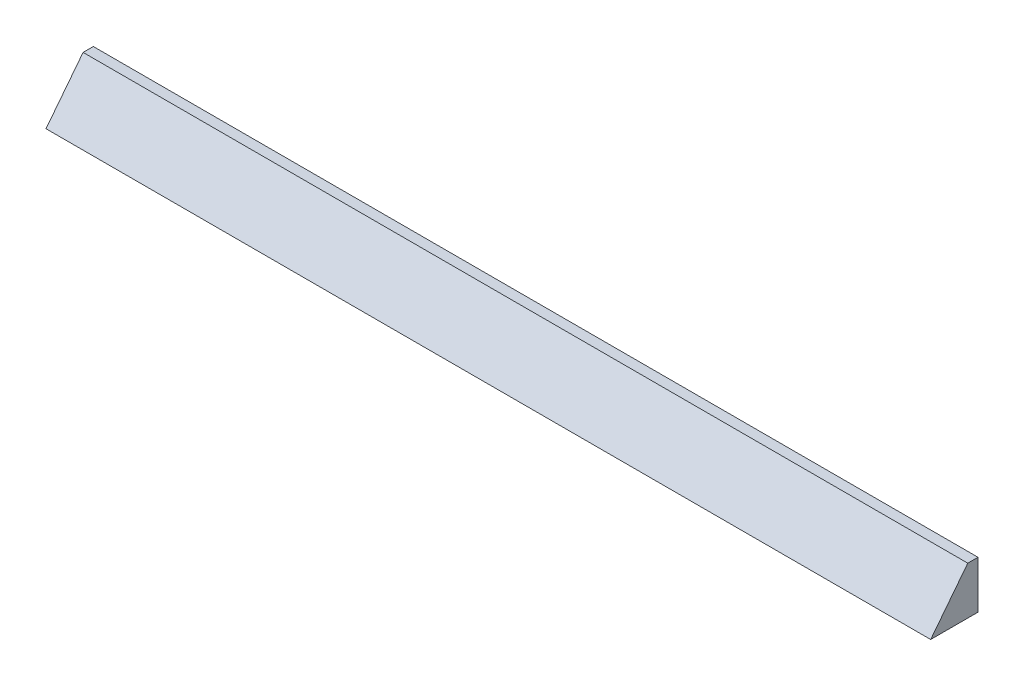
ISO-10303-21;
HEADER;
FILE_DESCRIPTION(('STEP AP214'),'2;1');
FILE_NAME('part.step','',(''),(''),'','','');
FILE_SCHEMA(('AUTOMOTIVE_DESIGN { 1 0 10303 214 1 1 1 1 }'));
ENDSEC;
DATA;
#1=APPLICATION_CONTEXT('core data for automotive mechanical design processes');
#2=APPLICATION_PROTOCOL_DEFINITION('international standard','automotive_design',2000,#1);
#3=PRODUCT_CONTEXT('',#1,'mechanical');
#4=PRODUCT('Part','Part','',(#3));
#5=PRODUCT_RELATED_PRODUCT_CATEGORY('part','',(#4));
#6=PRODUCT_DEFINITION_FORMATION('','',#4);
#7=PRODUCT_DEFINITION_CONTEXT('part definition',#1,'design');
#8=PRODUCT_DEFINITION('design','',#6,#7);
#9=PRODUCT_DEFINITION_SHAPE('','',#8);
#10=(LENGTH_UNIT() NAMED_UNIT(*) SI_UNIT(.MILLI.,.METRE.));
#11=(NAMED_UNIT(*) PLANE_ANGLE_UNIT() SI_UNIT($,.RADIAN.));
#12=(NAMED_UNIT(*) SI_UNIT($,.STERADIAN.) SOLID_ANGLE_UNIT());
#13=UNCERTAINTY_MEASURE_WITH_UNIT(LENGTH_MEASURE(1.E-05),#10,'distance_accuracy_value','');
#14=(GEOMETRIC_REPRESENTATION_CONTEXT(3) GLOBAL_UNCERTAINTY_ASSIGNED_CONTEXT((#13)) GLOBAL_UNIT_ASSIGNED_CONTEXT((#10,
#11,#12)) REPRESENTATION_CONTEXT('',''));
#15=CARTESIAN_POINT('',(0.,0.,0.));
#16=DIRECTION('',(0.,0.,1.));
#17=DIRECTION('',(1.,0.,0.));
#18=AXIS2_PLACEMENT_3D('',#15,#16,#17);
#19=CARTESIAN_POINT('',(-37.810925728328,1.33054580894509,39.0750825853909));
#20=DIRECTION('',(0.,-1.,0.));
#21=DIRECTION('',(0.,0.,-1.));
#22=AXIS2_PLACEMENT_3D('',#19,#20,#21);
#23=PLANE('',#22);
#24=DIRECTION('',(0.,0.,-1.));
#25=VECTOR('',#24,1.);
#26=CARTESIAN_POINT('',(55.189074271672,1.33054580894509,39.0750825853909));
#27=LINE('',#26,#25);
#28=CARTESIAN_POINT('',(55.189074271672,1.33054580894509,39.0750825853909));
#29=VERTEX_POINT('',#28);
#30=CARTESIAN_POINT('',(55.189074271672,1.33054580894509,38.));
#31=VERTEX_POINT('',#30);
#32=EDGE_CURVE('E96',#29,#31,#27,.T.);
#33=ORIENTED_EDGE('',*,*,#32,.T.);
#34=DIRECTION('',(1.,0.,0.));
#35=VECTOR('',#34,1.);
#36=CARTESIAN_POINT('',(-37.810925728328,1.33054580894509,38.));
#37=LINE('',#36,#35);
#38=CARTESIAN_POINT('',(-37.810925728328,1.33054580894509,38.));
#39=VERTEX_POINT('',#38);
#40=EDGE_CURVE('E11',#39,#31,#37,.T.);
#41=ORIENTED_EDGE('',*,*,#40,.F.);
#42=DIRECTION('',(0.,0.,-1.));
#43=VECTOR('',#42,1.);
#44=CARTESIAN_POINT('',(-37.810925728328,1.33054580894509,39.0750825853909));
#45=LINE('',#44,#43);
#46=CARTESIAN_POINT('',(-37.810925728328,1.33054580894509,39.0750825853909));
#47=VERTEX_POINT('',#46);
#48=EDGE_CURVE('E84',#47,#39,#45,.T.);
#49=ORIENTED_EDGE('',*,*,#48,.F.);
#50=DIRECTION('',(1.,0.,0.));
#51=VECTOR('',#50,1.);
#52=CARTESIAN_POINT('',(-37.810925728328,1.33054580894509,39.0750825853909));
#53=LINE('',#52,#51);
#54=EDGE_CURVE('E92',#47,#29,#53,.T.);
#55=ORIENTED_EDGE('',*,*,#54,.T.);
#56=EDGE_LOOP('',(#33,#41,#49,#55));
#57=FACE_BOUND('',#56,.T.);
#58=ADVANCED_FACE('F33',(#57),#23,.F.);
#59=CARTESIAN_POINT('',(-37.810925728328,1.33054580894509,38.));
#60=DIRECTION('',(0.,0.,1.));
#61=DIRECTION('',(1.,0.,0.));
#62=AXIS2_PLACEMENT_3D('',#59,#60,#61);
#63=PLANE('',#62);
#64=DIRECTION('',(0.,-1.,0.));
#65=VECTOR('',#64,1.);
#66=CARTESIAN_POINT('',(55.189074271672,1.33054580894509,38.));
#67=LINE('',#66,#65);
#68=CARTESIAN_POINT('',(55.189074271672,-3.66945419105491,38.));
#69=VERTEX_POINT('',#68);
#70=EDGE_CURVE('E88',#31,#69,#67,.T.);
#71=ORIENTED_EDGE('',*,*,#70,.T.);
#72=DIRECTION('',(1.,0.,0.));
#73=VECTOR('',#72,1.);
#74=CARTESIAN_POINT('',(-37.810925728328,-3.66945419105491,38.));
#75=LINE('',#74,#73);
#76=CARTESIAN_POINT('',(-37.810925728328,-3.66945419105491,38.));
#77=VERTEX_POINT('',#76);
#78=EDGE_CURVE('E41',#77,#69,#75,.T.);
#79=ORIENTED_EDGE('',*,*,#78,.F.);
#80=DIRECTION('',(0.,-1.,0.));
#81=VECTOR('',#80,1.);
#82=CARTESIAN_POINT('',(-37.810925728328,1.33054580894509,38.));
#83=LINE('',#82,#81);
#84=EDGE_CURVE('E79',#39,#77,#83,.T.);
#85=ORIENTED_EDGE('',*,*,#84,.F.);
#86=ORIENTED_EDGE('',*,*,#40,.T.);
#87=EDGE_LOOP('',(#71,#79,#85,#86));
#88=FACE_BOUND('',#87,.T.);
#89=ADVANCED_FACE('F87',(#88),#63,.F.);
#90=CARTESIAN_POINT('',(-37.810925728328,-3.66945419105491,38.));
#91=DIRECTION('',(0.,1.,0.));
#92=DIRECTION('',(0.,0.,1.));
#93=AXIS2_PLACEMENT_3D('',#90,#91,#92);
#94=PLANE('',#93);
#95=DIRECTION('',(0.,0.,1.));
#96=VECTOR('',#95,1.);
#97=CARTESIAN_POINT('',(55.189074271672,-3.66945419105491,38.));
#98=LINE('',#97,#96);
#99=CARTESIAN_POINT('',(55.189074271672,-3.66945419105491,42.9741951211435));
#100=VERTEX_POINT('',#99);
#101=EDGE_CURVE('E66',#69,#100,#98,.T.);
#102=ORIENTED_EDGE('',*,*,#101,.T.);
#103=DIRECTION('',(1.,0.,0.));
#104=VECTOR('',#103,1.);
#105=CARTESIAN_POINT('',(-37.810925728328,-3.66945419105491,42.9741951211435));
#106=LINE('',#105,#104);
#107=CARTESIAN_POINT('',(-37.810925728328,-3.66945419105491,42.9741951211435));
#108=VERTEX_POINT('',#107);
#109=EDGE_CURVE('E89',#108,#100,#106,.T.);
#110=ORIENTED_EDGE('',*,*,#109,.F.);
#111=DIRECTION('',(0.,0.,1.));
#112=VECTOR('',#111,1.);
#113=CARTESIAN_POINT('',(-37.810925728328,-3.66945419105491,38.));
#114=LINE('',#113,#112);
#115=EDGE_CURVE('E82',#77,#108,#114,.T.);
#116=ORIENTED_EDGE('',*,*,#115,.F.);
#117=ORIENTED_EDGE('',*,*,#78,.T.);
#118=EDGE_LOOP('',(#102,#110,#116,#117));
#119=FACE_BOUND('',#118,.T.);
#120=ADVANCED_FACE('F90',(#119),#94,.F.);
#121=CARTESIAN_POINT('',(-37.810925728328,-3.66945419105491,42.9741951211435));
#122=DIRECTION('',(0.,-0.614944773331857,-0.788570178076645));
#123=DIRECTION('',(0.,0.788570178076645,-0.614944773331857));
#124=AXIS2_PLACEMENT_3D('',#121,#122,#123);
#125=PLANE('',#124);
#126=DIRECTION('',(0.,0.788570178076645,-0.614944773331857));
#127=VECTOR('',#126,1.);
#128=CARTESIAN_POINT('',(55.189074271672,-3.66945419105491,42.9741951211435));
#129=LINE('',#128,#127);
#130=EDGE_CURVE('E72',#100,#29,#129,.T.);
#131=ORIENTED_EDGE('',*,*,#130,.T.);
#132=ORIENTED_EDGE('',*,*,#54,.F.);
#133=DIRECTION('',(0.,0.788570178076645,-0.614944773331857));
#134=VECTOR('',#133,1.);
#135=CARTESIAN_POINT('',(-37.810925728328,-3.66945419105491,42.9741951211435));
#136=LINE('',#135,#134);
#137=EDGE_CURVE('E49',#108,#47,#136,.T.);
#138=ORIENTED_EDGE('',*,*,#137,.F.);
#139=ORIENTED_EDGE('',*,*,#109,.T.);
#140=EDGE_LOOP('',(#131,#132,#138,#139));
#141=FACE_BOUND('',#140,.T.);
#142=ADVANCED_FACE('F103',(#141),#125,.F.);
#143=CARTESIAN_POINT('',(-37.810925728328,0.,0.));
#144=DIRECTION('',(-1.,0.,0.));
#145=DIRECTION('',(0.,0.,1.));
#146=AXIS2_PLACEMENT_3D('',#143,#144,#145);
#147=PLANE('',#146);
#148=ORIENTED_EDGE('',*,*,#48,.T.);
#149=ORIENTED_EDGE('',*,*,#84,.T.);
#150=ORIENTED_EDGE('',*,*,#115,.T.);
#151=ORIENTED_EDGE('',*,*,#137,.T.);
#152=EDGE_LOOP('',(#148,#149,#150,#151));
#153=FACE_BOUND('',#152,.T.);
#154=ADVANCED_FACE('F80',(#153),#147,.T.);
#155=CARTESIAN_POINT('',(55.189074271672,0.,0.));
#156=DIRECTION('',(-1.,0.,0.));
#157=DIRECTION('',(0.,0.,1.));
#158=AXIS2_PLACEMENT_3D('',#155,#156,#157);
#159=PLANE('',#158);
#160=ORIENTED_EDGE('',*,*,#32,.F.);
#161=ORIENTED_EDGE('',*,*,#130,.F.);
#162=ORIENTED_EDGE('',*,*,#101,.F.);
#163=ORIENTED_EDGE('',*,*,#70,.F.);
#164=EDGE_LOOP('',(#160,#161,#162,#163));
#165=FACE_BOUND('',#164,.T.);
#166=ADVANCED_FACE('F106',(#165),#159,.F.);
#167=CLOSED_SHELL('',(#58,#89,#120,#142,#154,#166));
#168=MANIFOLD_SOLID_BREP('B2',#167);
#169=ADVANCED_BREP_SHAPE_REPRESENTATION('',(#18,#168),#14);
#170=SHAPE_DEFINITION_REPRESENTATION(#9,#169);
ENDSEC;
END-ISO-10303-21;
